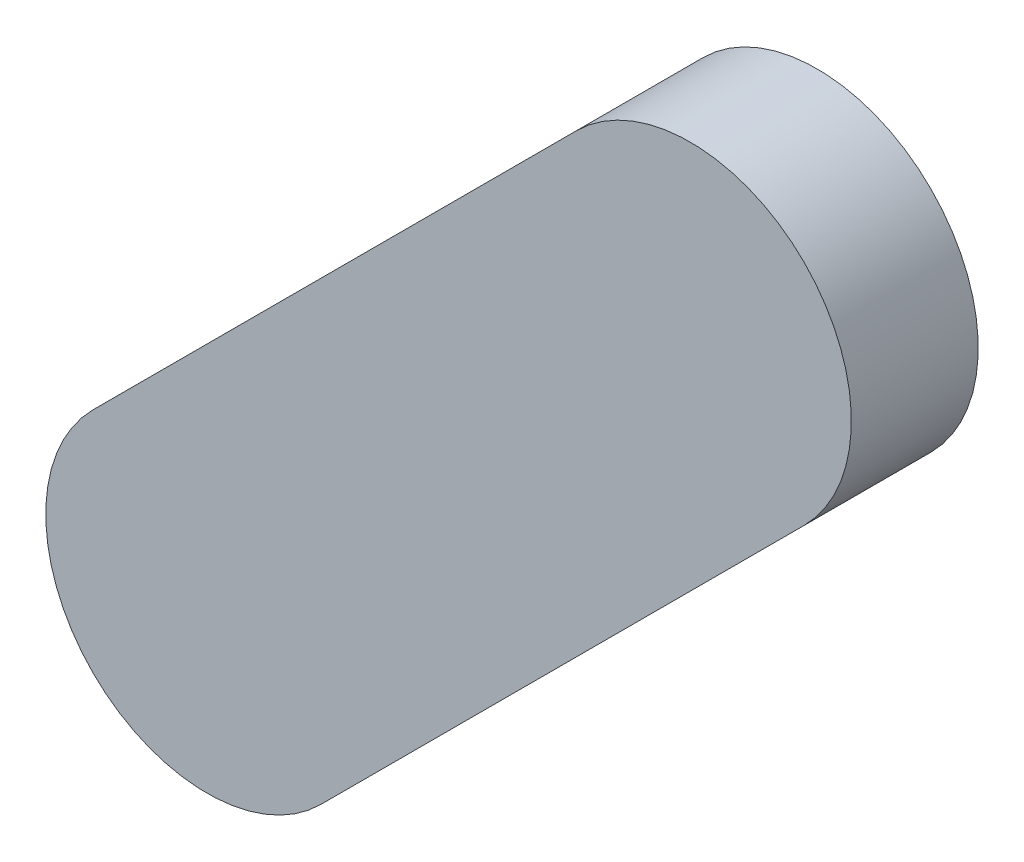
ISO-10303-21;
HEADER;
FILE_DESCRIPTION(('STEP AP214'),'2;1');
FILE_NAME('part.step','',(''),(''),'','','');
FILE_SCHEMA(('AUTOMOTIVE_DESIGN { 1 0 10303 214 1 1 1 1 }'));
ENDSEC;
DATA;
#1=APPLICATION_CONTEXT('core data for automotive mechanical design processes');
#2=APPLICATION_PROTOCOL_DEFINITION('international standard','automotive_design',2000,#1);
#3=PRODUCT_CONTEXT('',#1,'mechanical');
#4=PRODUCT('Part','Part','',(#3));
#5=PRODUCT_RELATED_PRODUCT_CATEGORY('part','',(#4));
#6=PRODUCT_DEFINITION_FORMATION('','',#4);
#7=PRODUCT_DEFINITION_CONTEXT('part definition',#1,'design');
#8=PRODUCT_DEFINITION('design','',#6,#7);
#9=PRODUCT_DEFINITION_SHAPE('','',#8);
#10=(LENGTH_UNIT() NAMED_UNIT(*) SI_UNIT(.MILLI.,.METRE.));
#11=(NAMED_UNIT(*) PLANE_ANGLE_UNIT() SI_UNIT($,.RADIAN.));
#12=(NAMED_UNIT(*) SI_UNIT($,.STERADIAN.) SOLID_ANGLE_UNIT());
#13=UNCERTAINTY_MEASURE_WITH_UNIT(LENGTH_MEASURE(1.E-05),#10,'distance_accuracy_value','');
#14=(GEOMETRIC_REPRESENTATION_CONTEXT(3) GLOBAL_UNCERTAINTY_ASSIGNED_CONTEXT((#13)) GLOBAL_UNIT_ASSIGNED_CONTEXT((#10,
#11,#12)) REPRESENTATION_CONTEXT('',''));
#15=CARTESIAN_POINT('',(0.,0.,0.));
#16=DIRECTION('',(0.,0.,1.));
#17=DIRECTION('',(1.,0.,0.));
#18=AXIS2_PLACEMENT_3D('',#15,#16,#17);
#19=CARTESIAN_POINT('',(138.60960594,55.82739406,0.));
#20=DIRECTION('',(-0.707106781186548,0.707106781186548,0.));
#21=DIRECTION('',(0.707106781186548,0.707106781186548,0.));
#22=AXIS2_PLACEMENT_3D('',#19,#20,#21);
#23=PLANE('',#22);
#24=DIRECTION('',(0.707106781186548,0.707106781186548,0.));
#25=VECTOR('',#24,1.);
#26=CARTESIAN_POINT('',(138.60960594,55.82739406,0.1999996));
#27=LINE('',#26,#25);
#28=CARTESIAN_POINT('',(138.60960594,55.82739406,0.1999996));
#29=VERTEX_POINT('',#28);
#30=CARTESIAN_POINT('',(139.37160594,56.58939406,0.1999996));
#31=VERTEX_POINT('',#30);
#32=EDGE_CURVE('E11',#29,#31,#27,.T.);
#33=ORIENTED_EDGE('',*,*,#32,.F.);
#34=DIRECTION('',(0.,0.,1.));
#35=VECTOR('',#34,1.);
#36=CARTESIAN_POINT('',(138.60960594,55.82739406,0.));
#37=LINE('',#36,#35);
#38=CARTESIAN_POINT('',(138.60960594,55.82739406,0.));
#39=VERTEX_POINT('',#38);
#40=EDGE_CURVE('E24',#39,#29,#37,.T.);
#41=ORIENTED_EDGE('',*,*,#40,.F.);
#42=DIRECTION('',(0.707106781186548,0.707106781186548,0.));
#43=VECTOR('',#42,1.);
#44=CARTESIAN_POINT('',(138.60960594,55.82739406,0.));
#45=LINE('',#44,#43);
#46=CARTESIAN_POINT('',(139.37160594,56.58939406,0.));
#47=VERTEX_POINT('',#46);
#48=EDGE_CURVE('E75',#39,#47,#45,.T.);
#49=ORIENTED_EDGE('',*,*,#48,.T.);
#50=DIRECTION('',(0.,0.,1.));
#51=VECTOR('',#50,1.);
#52=CARTESIAN_POINT('',(139.37160594,56.58939406,0.));
#53=LINE('',#52,#51);
#54=EDGE_CURVE('E37',#47,#31,#53,.T.);
#55=ORIENTED_EDGE('',*,*,#54,.T.);
#56=EDGE_LOOP('',(#33,#41,#49,#55));
#57=FACE_BOUND('',#56,.T.);
#58=ADVANCED_FACE('F17',(#57),#23,.F.);
#59=CARTESIAN_POINT('',(139.192,56.769,0.));
#60=DIRECTION('',(0.,0.,-1.));
#61=DIRECTION('',(0.70710678118652,-0.707106781186576,0.));
#62=AXIS2_PLACEMENT_3D('',#59,#60,#61);
#63=CYLINDRICAL_SURFACE('',#62,0.254001156230768);
#64=CARTESIAN_POINT('',(139.192,56.769,0.1999996));
#65=DIRECTION('',(0.,0.,1.));
#66=DIRECTION('',(0.70710678118652,-0.707106781186576,0.));
#67=AXIS2_PLACEMENT_3D('',#64,#65,#66);
#68=CIRCLE('',#67,0.254001156230768);
#69=CARTESIAN_POINT('',(139.01239406,56.94860594,0.1999996));
#70=VERTEX_POINT('',#69);
#71=EDGE_CURVE('E83',#31,#70,#68,.T.);
#72=ORIENTED_EDGE('',*,*,#71,.F.);
#73=ORIENTED_EDGE('',*,*,#54,.F.);
#74=CARTESIAN_POINT('',(139.192,56.769,0.));
#75=DIRECTION('',(0.,0.,1.));
#76=DIRECTION('',(0.70710678118652,-0.707106781186576,0.));
#77=AXIS2_PLACEMENT_3D('',#74,#75,#76);
#78=CIRCLE('',#77,0.254001156230768);
#79=CARTESIAN_POINT('',(139.01239406,56.94860594,0.));
#80=VERTEX_POINT('',#79);
#81=EDGE_CURVE('E81',#47,#80,#78,.T.);
#82=ORIENTED_EDGE('',*,*,#81,.T.);
#83=DIRECTION('',(0.,0.,1.));
#84=VECTOR('',#83,1.);
#85=CARTESIAN_POINT('',(139.01239406,56.94860594,0.));
#86=LINE('',#85,#84);
#87=EDGE_CURVE('E67',#80,#70,#86,.T.);
#88=ORIENTED_EDGE('',*,*,#87,.T.);
#89=EDGE_LOOP('',(#72,#73,#82,#88));
#90=FACE_BOUND('',#89,.T.);
#91=ADVANCED_FACE('F89',(#90),#63,.T.);
#92=CARTESIAN_POINT('',(139.01239406,56.94860594,0.));
#93=DIRECTION('',(0.707106781186548,-0.707106781186548,0.));
#94=DIRECTION('',(-0.707106781186548,-0.707106781186548,0.));
#95=AXIS2_PLACEMENT_3D('',#92,#93,#94);
#96=PLANE('',#95);
#97=DIRECTION('',(-0.707106781186548,-0.707106781186548,0.));
#98=VECTOR('',#97,1.);
#99=CARTESIAN_POINT('',(139.01239406,56.94860594,0.1999996));
#100=LINE('',#99,#98);
#101=CARTESIAN_POINT('',(138.25039406,56.18660594,0.1999996));
#102=VERTEX_POINT('',#101);
#103=EDGE_CURVE('E71',#70,#102,#100,.T.);
#104=ORIENTED_EDGE('',*,*,#103,.F.);
#105=ORIENTED_EDGE('',*,*,#87,.F.);
#106=DIRECTION('',(-0.707106781186548,-0.707106781186548,0.));
#107=VECTOR('',#106,1.);
#108=CARTESIAN_POINT('',(139.01239406,56.94860594,0.));
#109=LINE('',#108,#107);
#110=CARTESIAN_POINT('',(138.25039406,56.18660594,0.));
#111=VERTEX_POINT('',#110);
#112=EDGE_CURVE('E63',#80,#111,#109,.T.);
#113=ORIENTED_EDGE('',*,*,#112,.T.);
#114=DIRECTION('',(0.,0.,1.));
#115=VECTOR('',#114,1.);
#116=CARTESIAN_POINT('',(138.25039406,56.18660594,0.));
#117=LINE('',#116,#115);
#118=EDGE_CURVE('E53',#111,#102,#117,.T.);
#119=ORIENTED_EDGE('',*,*,#118,.T.);
#120=EDGE_LOOP('',(#104,#105,#113,#119));
#121=FACE_BOUND('',#120,.T.);
#122=ADVANCED_FACE('F66',(#121),#96,.F.);
#123=CARTESIAN_POINT('',(138.43,56.007,0.));
#124=DIRECTION('',(0.,0.,-1.));
#125=DIRECTION('',(-0.707106781186576,0.70710678118652,0.));
#126=AXIS2_PLACEMENT_3D('',#123,#124,#125);
#127=CYLINDRICAL_SURFACE('',#126,0.254001156230774);
#128=CARTESIAN_POINT('',(138.43,56.007,0.1999996));
#129=DIRECTION('',(0.,0.,1.));
#130=DIRECTION('',(-0.707106781186576,0.70710678118652,0.));
#131=AXIS2_PLACEMENT_3D('',#128,#129,#130);
#132=CIRCLE('',#131,0.254001156230774);
#133=EDGE_CURVE('E59',#102,#29,#132,.T.);
#134=ORIENTED_EDGE('',*,*,#133,.F.);
#135=ORIENTED_EDGE('',*,*,#118,.F.);
#136=CARTESIAN_POINT('',(138.43,56.007,0.));
#137=DIRECTION('',(0.,0.,1.));
#138=DIRECTION('',(-0.707106781186576,0.70710678118652,0.));
#139=AXIS2_PLACEMENT_3D('',#136,#137,#138);
#140=CIRCLE('',#139,0.254001156230774);
#141=EDGE_CURVE('E57',#111,#39,#140,.T.);
#142=ORIENTED_EDGE('',*,*,#141,.T.);
#143=ORIENTED_EDGE('',*,*,#40,.T.);
#144=EDGE_LOOP('',(#134,#135,#142,#143));
#145=FACE_BOUND('',#144,.T.);
#146=ADVANCED_FACE('F55',(#145),#127,.T.);
#147=CARTESIAN_POINT('',(138.60960594,55.82739406,0.));
#148=DIRECTION('',(0.,0.,-1.));
#149=DIRECTION('',(-1.,0.,0.));
#150=AXIS2_PLACEMENT_3D('',#147,#148,#149);
#151=PLANE('',#150);
#152=ORIENTED_EDGE('',*,*,#141,.F.);
#153=ORIENTED_EDGE('',*,*,#112,.F.);
#154=ORIENTED_EDGE('',*,*,#81,.F.);
#155=ORIENTED_EDGE('',*,*,#48,.F.);
#156=EDGE_LOOP('',(#152,#153,#154,#155));
#157=FACE_BOUND('',#156,.T.);
#158=ADVANCED_FACE('F74',(#157),#151,.T.);
#159=CARTESIAN_POINT('',(138.60960594,55.82739406,0.1999996));
#160=DIRECTION('',(0.,0.,-1.));
#161=DIRECTION('',(-1.,0.,0.));
#162=AXIS2_PLACEMENT_3D('',#159,#160,#161);
#163=PLANE('',#162);
#164=ORIENTED_EDGE('',*,*,#32,.T.);
#165=ORIENTED_EDGE('',*,*,#71,.T.);
#166=ORIENTED_EDGE('',*,*,#103,.T.);
#167=ORIENTED_EDGE('',*,*,#133,.T.);
#168=EDGE_LOOP('',(#164,#165,#166,#167));
#169=FACE_BOUND('',#168,.T.);
#170=ADVANCED_FACE('F91',(#169),#163,.F.);
#171=CLOSED_SHELL('',(#58,#91,#122,#146,#158,#170));
#172=MANIFOLD_SOLID_BREP('B1',#171);
#173=ADVANCED_BREP_SHAPE_REPRESENTATION('',(#18,#172),#14);
#174=SHAPE_DEFINITION_REPRESENTATION(#9,#173);
ENDSEC;
END-ISO-10303-21;
